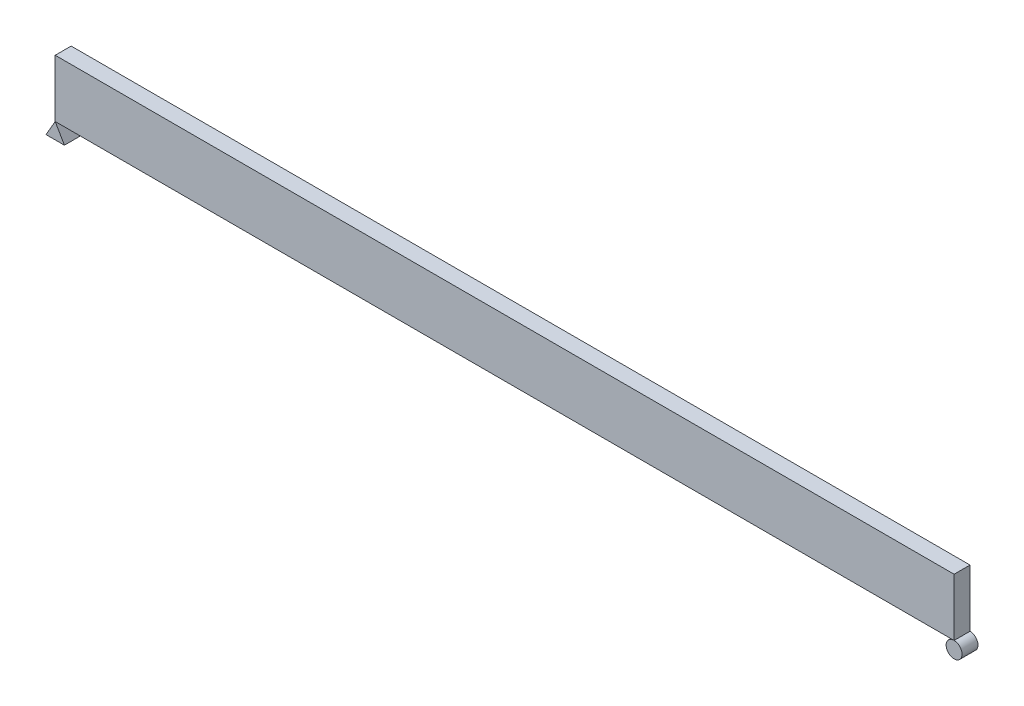
ISO-10303-21;
HEADER;
FILE_DESCRIPTION(('STEP AP214'),'2;1');
FILE_NAME('part.step','',(''),(''),'','','');
FILE_SCHEMA(('AUTOMOTIVE_DESIGN { 1 0 10303 214 1 1 1 1 }'));
ENDSEC;
DATA;
#1=APPLICATION_CONTEXT('core data for automotive mechanical design processes');
#2=APPLICATION_PROTOCOL_DEFINITION('international standard','automotive_design',2000,#1);
#3=PRODUCT_CONTEXT('',#1,'mechanical');
#4=PRODUCT('Part','Part','',(#3));
#5=PRODUCT_RELATED_PRODUCT_CATEGORY('part','',(#4));
#6=PRODUCT_DEFINITION_FORMATION('','',#4);
#7=PRODUCT_DEFINITION_CONTEXT('part definition',#1,'design');
#8=PRODUCT_DEFINITION('design','',#6,#7);
#9=PRODUCT_DEFINITION_SHAPE('','',#8);
#10=(LENGTH_UNIT() NAMED_UNIT(*) SI_UNIT(.MILLI.,.METRE.));
#11=(NAMED_UNIT(*) PLANE_ANGLE_UNIT() SI_UNIT($,.RADIAN.));
#12=(NAMED_UNIT(*) SI_UNIT($,.STERADIAN.) SOLID_ANGLE_UNIT());
#13=UNCERTAINTY_MEASURE_WITH_UNIT(LENGTH_MEASURE(1.E-05),#10,'distance_accuracy_value','');
#14=(GEOMETRIC_REPRESENTATION_CONTEXT(3) GLOBAL_UNCERTAINTY_ASSIGNED_CONTEXT((#13)) GLOBAL_UNIT_ASSIGNED_CONTEXT((#10,
#11,#12)) REPRESENTATION_CONTEXT('',''));
#15=CARTESIAN_POINT('',(0.,0.,0.));
#16=DIRECTION('',(0.,0.,1.));
#17=DIRECTION('',(1.,0.,0.));
#18=AXIS2_PLACEMENT_3D('',#15,#16,#17);
#19=CARTESIAN_POINT('',(3581.4,-292.1,127.));
#20=DIRECTION('',(0.,0.,-1.));
#21=DIRECTION('',(-1.,0.,0.));
#22=AXIS2_PLACEMENT_3D('',#19,#20,#21);
#23=CYLINDRICAL_SURFACE('',#22,63.4999999999998);
#24=CARTESIAN_POINT('',(3581.4,-292.1,0.));
#25=DIRECTION('',(0.,0.,1.));
#26=DIRECTION('',(1.,0.,0.));
#27=AXIS2_PLACEMENT_3D('',#24,#25,#26);
#28=CIRCLE('',#27,63.4999999999998);
#29=CARTESIAN_POINT('',(3644.9,-292.1,0.));
#30=VERTEX_POINT('',#29);
#31=EDGE_CURVE('E11',#30,#30,#28,.T.);
#32=ORIENTED_EDGE('',*,*,#31,.T.);
#33=EDGE_LOOP('',(#32));
#34=FACE_BOUND('',#33,.T.);
#35=CARTESIAN_POINT('',(3581.4,-292.1,127.));
#36=DIRECTION('',(0.,0.,1.));
#37=DIRECTION('',(1.,0.,0.));
#38=AXIS2_PLACEMENT_3D('',#35,#36,#37);
#39=CIRCLE('',#38,63.4999999999998);
#40=CARTESIAN_POINT('',(3644.9,-292.1,127.));
#41=VERTEX_POINT('',#40);
#42=EDGE_CURVE('E57',#41,#41,#39,.T.);
#43=ORIENTED_EDGE('',*,*,#42,.F.);
#44=EDGE_LOOP('',(#43));
#45=FACE_BOUND('',#44,.T.);
#46=ADVANCED_FACE('F53',(#34,#45),#23,.T.);
#47=CARTESIAN_POINT('',(3581.4,-292.1,127.));
#48=DIRECTION('',(0.,0.,1.));
#49=DIRECTION('',(1.,0.,0.));
#50=AXIS2_PLACEMENT_3D('',#47,#48,#49);
#51=PLANE('',#50);
#52=ORIENTED_EDGE('',*,*,#42,.T.);
#53=EDGE_LOOP('',(#52));
#54=FACE_BOUND('',#53,.T.);
#55=ADVANCED_FACE('F55',(#54),#51,.T.);
#56=CARTESIAN_POINT('',(3581.4,-292.1,0.));
#57=DIRECTION('',(0.,0.,1.));
#58=DIRECTION('',(1.,0.,0.));
#59=AXIS2_PLACEMENT_3D('',#56,#57,#58);
#60=PLANE('',#59);
#61=ORIENTED_EDGE('',*,*,#31,.F.);
#62=EDGE_LOOP('',(#61));
#63=FACE_BOUND('',#62,.T.);
#64=ADVANCED_FACE('F71',(#63),#60,.F.);
#65=CLOSED_SHELL('',(#46,#55,#64));
#66=MANIFOLD_SOLID_BREP('B2',#65);
#67=CARTESIAN_POINT('',(-3654.72348418708,-355.6,127.));
#68=DIRECTION('',(-0.866025403784437,0.500000000000003,0.));
#69=DIRECTION('',(-0.500000000000003,-0.866025403784437,0.));
#70=AXIS2_PLACEMENT_3D('',#67,#68,#69);
#71=PLANE('',#70);
#72=DIRECTION('',(0.500000000000003,0.866025403784437,0.));
#73=VECTOR('',#72,1.);
#74=CARTESIAN_POINT('',(-3654.72348418708,-355.6,0.));
#75=LINE('',#74,#73);
#76=CARTESIAN_POINT('',(-3654.72348418708,-355.6,0.));
#77=VERTEX_POINT('',#76);
#78=CARTESIAN_POINT('',(-3581.4,-228.6,0.));
#79=VERTEX_POINT('',#78);
#80=EDGE_CURVE('E51',#77,#79,#75,.T.);
#81=ORIENTED_EDGE('',*,*,#80,.F.);
#82=DIRECTION('',(0.,0.,-1.));
#83=VECTOR('',#82,1.);
#84=CARTESIAN_POINT('',(-3654.72348418708,-355.6,127.));
#85=LINE('',#84,#83);
#86=CARTESIAN_POINT('',(-3654.72348418708,-355.6,127.));
#87=VERTEX_POINT('',#86);
#88=EDGE_CURVE('E143',#87,#77,#85,.T.);
#89=ORIENTED_EDGE('',*,*,#88,.F.);
#90=DIRECTION('',(0.500000000000003,0.866025403784437,0.));
#91=VECTOR('',#90,1.);
#92=CARTESIAN_POINT('',(-3654.72348418708,-355.6,127.));
#93=LINE('',#92,#91);
#94=CARTESIAN_POINT('',(-3581.4,-228.6,127.));
#95=VERTEX_POINT('',#94);
#96=EDGE_CURVE('E145',#87,#95,#93,.T.);
#97=ORIENTED_EDGE('',*,*,#96,.T.);
#98=DIRECTION('',(0.,0.,-1.));
#99=VECTOR('',#98,1.);
#100=CARTESIAN_POINT('',(-3581.4,-228.6,127.));
#101=LINE('',#100,#99);
#102=EDGE_CURVE('E109',#95,#79,#101,.T.);
#103=ORIENTED_EDGE('',*,*,#102,.T.);
#104=EDGE_LOOP('',(#81,#89,#97,#103));
#105=FACE_BOUND('',#104,.T.);
#106=ADVANCED_FACE('F105',(#105),#71,.T.);
#107=CARTESIAN_POINT('',(-3508.07651581292,-355.6,127.));
#108=DIRECTION('',(0.,-1.,0.));
#109=DIRECTION('',(1.,0.,0.));
#110=AXIS2_PLACEMENT_3D('',#107,#108,#109);
#111=PLANE('',#110);
#112=DIRECTION('',(-1.,0.,0.));
#113=VECTOR('',#112,1.);
#114=CARTESIAN_POINT('',(-3508.07651581292,-355.6,0.));
#115=LINE('',#114,#113);
#116=CARTESIAN_POINT('',(-3508.07651581292,-355.6,0.));
#117=VERTEX_POINT('',#116);
#118=EDGE_CURVE('E148',#117,#77,#115,.T.);
#119=ORIENTED_EDGE('',*,*,#118,.F.);
#120=DIRECTION('',(0.,0.,-1.));
#121=VECTOR('',#120,1.);
#122=CARTESIAN_POINT('',(-3508.07651581292,-355.6,127.));
#123=LINE('',#122,#121);
#124=CARTESIAN_POINT('',(-3508.07651581292,-355.6,127.));
#125=VERTEX_POINT('',#124);
#126=EDGE_CURVE('E124',#125,#117,#123,.T.);
#127=ORIENTED_EDGE('',*,*,#126,.F.);
#128=DIRECTION('',(-1.,0.,0.));
#129=VECTOR('',#128,1.);
#130=CARTESIAN_POINT('',(-3508.07651581292,-355.6,127.));
#131=LINE('',#130,#129);
#132=EDGE_CURVE('E149',#125,#87,#131,.T.);
#133=ORIENTED_EDGE('',*,*,#132,.T.);
#134=ORIENTED_EDGE('',*,*,#88,.T.);
#135=EDGE_LOOP('',(#119,#127,#133,#134));
#136=FACE_BOUND('',#135,.T.);
#137=ADVANCED_FACE('F159',(#136),#111,.T.);
#138=CARTESIAN_POINT('',(-3581.4,-228.6,127.));
#139=DIRECTION('',(0.866025403784437,0.500000000000003,0.));
#140=DIRECTION('',(-0.500000000000003,0.866025403784437,0.));
#141=AXIS2_PLACEMENT_3D('',#138,#139,#140);
#142=PLANE('',#141);
#143=DIRECTION('',(0.500000000000003,-0.866025403784437,0.));
#144=VECTOR('',#143,1.);
#145=CARTESIAN_POINT('',(-3581.4,-228.6,0.));
#146=LINE('',#145,#144);
#147=EDGE_CURVE('E115',#79,#117,#146,.T.);
#148=ORIENTED_EDGE('',*,*,#147,.F.);
#149=ORIENTED_EDGE('',*,*,#102,.F.);
#150=DIRECTION('',(0.500000000000003,-0.866025403784437,0.));
#151=VECTOR('',#150,1.);
#152=CARTESIAN_POINT('',(-3581.4,-228.6,127.));
#153=LINE('',#152,#151);
#154=EDGE_CURVE('E141',#95,#125,#153,.T.);
#155=ORIENTED_EDGE('',*,*,#154,.T.);
#156=ORIENTED_EDGE('',*,*,#126,.T.);
#157=EDGE_LOOP('',(#148,#149,#155,#156));
#158=FACE_BOUND('',#157,.T.);
#159=ADVANCED_FACE('F139',(#158),#142,.T.);
#160=CARTESIAN_POINT('',(0.,0.,127.));
#161=DIRECTION('',(0.,0.,-1.));
#162=DIRECTION('',(-1.,0.,0.));
#163=AXIS2_PLACEMENT_3D('',#160,#161,#162);
#164=PLANE('',#163);
#165=ORIENTED_EDGE('',*,*,#96,.F.);
#166=ORIENTED_EDGE('',*,*,#132,.F.);
#167=ORIENTED_EDGE('',*,*,#154,.F.);
#168=EDGE_LOOP('',(#165,#166,#167));
#169=FACE_BOUND('',#168,.T.);
#170=ADVANCED_FACE('F107',(#169),#164,.F.);
#171=CARTESIAN_POINT('',(0.,0.,0.));
#172=DIRECTION('',(0.,0.,-1.));
#173=DIRECTION('',(-1.,0.,0.));
#174=AXIS2_PLACEMENT_3D('',#171,#172,#173);
#175=PLANE('',#174);
#176=ORIENTED_EDGE('',*,*,#80,.T.);
#177=ORIENTED_EDGE('',*,*,#147,.T.);
#178=ORIENTED_EDGE('',*,*,#118,.T.);
#179=EDGE_LOOP('',(#176,#177,#178));
#180=FACE_BOUND('',#179,.T.);
#181=ADVANCED_FACE('F161',(#180),#175,.T.);
#182=CLOSED_SHELL('',(#106,#137,#159,#170,#181));
#183=MANIFOLD_SOLID_BREP('B6',#182);
#184=CARTESIAN_POINT('',(3581.4,0.,127.));
#185=DIRECTION('',(1.,0.,0.));
#186=DIRECTION('',(0.,0.,-1.));
#187=AXIS2_PLACEMENT_3D('',#184,#185,#186);
#188=PLANE('',#187);
#189=DIRECTION('',(0.,-1.,0.));
#190=VECTOR('',#189,1.);
#191=CARTESIAN_POINT('',(3581.4,0.,0.));
#192=LINE('',#191,#190);
#193=CARTESIAN_POINT('',(3581.4,228.6,0.));
#194=VERTEX_POINT('',#193);
#195=CARTESIAN_POINT('',(3581.4,-228.6,0.));
#196=VERTEX_POINT('',#195);
#197=EDGE_CURVE('E224',#194,#196,#192,.T.);
#198=ORIENTED_EDGE('',*,*,#197,.F.);
#199=DIRECTION('',(0.,0.,-1.));
#200=VECTOR('',#199,1.);
#201=CARTESIAN_POINT('',(3581.4,228.6,127.));
#202=LINE('',#201,#200);
#203=CARTESIAN_POINT('',(3581.4,228.6,127.));
#204=VERTEX_POINT('',#203);
#205=EDGE_CURVE('E206',#204,#194,#202,.T.);
#206=ORIENTED_EDGE('',*,*,#205,.F.);
#207=DIRECTION('',(0.,-1.,0.));
#208=VECTOR('',#207,1.);
#209=CARTESIAN_POINT('',(3581.4,0.,127.));
#210=LINE('',#209,#208);
#211=CARTESIAN_POINT('',(3581.4,-228.6,127.));
#212=VERTEX_POINT('',#211);
#213=EDGE_CURVE('E244',#204,#212,#210,.T.);
#214=ORIENTED_EDGE('',*,*,#213,.T.);
#215=DIRECTION('',(0.,0.,-1.));
#216=VECTOR('',#215,1.);
#217=CARTESIAN_POINT('',(3581.4,-228.6,127.));
#218=LINE('',#217,#216);
#219=EDGE_CURVE('E103',#212,#196,#218,.T.);
#220=ORIENTED_EDGE('',*,*,#219,.T.);
#221=EDGE_LOOP('',(#198,#206,#214,#220));
#222=FACE_BOUND('',#221,.T.);
#223=ADVANCED_FACE('F203',(#222),#188,.T.);
#224=CARTESIAN_POINT('',(0.,228.6,127.));
#225=DIRECTION('',(0.,1.,0.));
#226=DIRECTION('',(0.,0.,1.));
#227=AXIS2_PLACEMENT_3D('',#224,#225,#226);
#228=PLANE('',#227);
#229=DIRECTION('',(1.,0.,0.));
#230=VECTOR('',#229,1.);
#231=CARTESIAN_POINT('',(0.,228.6,0.));
#232=LINE('',#231,#230);
#233=CARTESIAN_POINT('',(-3581.4,228.6,0.));
#234=VERTEX_POINT('',#233);
#235=EDGE_CURVE('E266',#234,#194,#232,.T.);
#236=ORIENTED_EDGE('',*,*,#235,.F.);
#237=DIRECTION('',(0.,0.,-1.));
#238=VECTOR('',#237,1.);
#239=CARTESIAN_POINT('',(-3581.4,228.6,127.));
#240=LINE('',#239,#238);
#241=CARTESIAN_POINT('',(-3581.4,228.6,127.));
#242=VERTEX_POINT('',#241);
#243=EDGE_CURVE('E249',#242,#234,#240,.T.);
#244=ORIENTED_EDGE('',*,*,#243,.F.);
#245=DIRECTION('',(1.,0.,0.));
#246=VECTOR('',#245,1.);
#247=CARTESIAN_POINT('',(0.,228.6,127.));
#248=LINE('',#247,#246);
#249=EDGE_CURVE('E254',#242,#204,#248,.T.);
#250=ORIENTED_EDGE('',*,*,#249,.T.);
#251=ORIENTED_EDGE('',*,*,#205,.T.);
#252=EDGE_LOOP('',(#236,#244,#250,#251));
#253=FACE_BOUND('',#252,.T.);
#254=ADVANCED_FACE('F258',(#253),#228,.T.);
#255=CARTESIAN_POINT('',(-3581.4,0.,127.));
#256=DIRECTION('',(1.,0.,0.));
#257=DIRECTION('',(0.,0.,-1.));
#258=AXIS2_PLACEMENT_3D('',#255,#256,#257);
#259=PLANE('',#258);
#260=DIRECTION('',(0.,-1.,0.));
#261=VECTOR('',#260,1.);
#262=CARTESIAN_POINT('',(-3581.4,0.,0.));
#263=LINE('',#262,#261);
#264=CARTESIAN_POINT('',(-3581.4,-228.6,0.));
#265=VERTEX_POINT('',#264);
#266=EDGE_CURVE('E268',#234,#265,#263,.T.);
#267=ORIENTED_EDGE('',*,*,#266,.T.);
#268=DIRECTION('',(0.,0.,-1.));
#269=VECTOR('',#268,1.);
#270=CARTESIAN_POINT('',(-3581.4,-228.6,127.));
#271=LINE('',#270,#269);
#272=CARTESIAN_POINT('',(-3581.4,-228.6,127.));
#273=VERTEX_POINT('',#272);
#274=EDGE_CURVE('E211',#273,#265,#271,.T.);
#275=ORIENTED_EDGE('',*,*,#274,.F.);
#276=DIRECTION('',(0.,-1.,0.));
#277=VECTOR('',#276,1.);
#278=CARTESIAN_POINT('',(-3581.4,0.,127.));
#279=LINE('',#278,#277);
#280=EDGE_CURVE('E260',#242,#273,#279,.T.);
#281=ORIENTED_EDGE('',*,*,#280,.F.);
#282=ORIENTED_EDGE('',*,*,#243,.T.);
#283=EDGE_LOOP('',(#267,#275,#281,#282));
#284=FACE_BOUND('',#283,.T.);
#285=ADVANCED_FACE('F274',(#284),#259,.F.);
#286=CARTESIAN_POINT('',(0.,-228.6,127.));
#287=DIRECTION('',(0.,1.,0.));
#288=DIRECTION('',(0.,0.,1.));
#289=AXIS2_PLACEMENT_3D('',#286,#287,#288);
#290=PLANE('',#289);
#291=DIRECTION('',(1.,0.,0.));
#292=VECTOR('',#291,1.);
#293=CARTESIAN_POINT('',(0.,-228.6,0.));
#294=LINE('',#293,#292);
#295=EDGE_CURVE('E219',#265,#196,#294,.T.);
#296=ORIENTED_EDGE('',*,*,#295,.T.);
#297=ORIENTED_EDGE('',*,*,#219,.F.);
#298=DIRECTION('',(1.,0.,0.));
#299=VECTOR('',#298,1.);
#300=CARTESIAN_POINT('',(0.,-228.6,127.));
#301=LINE('',#300,#299);
#302=EDGE_CURVE('E255',#273,#212,#301,.T.);
#303=ORIENTED_EDGE('',*,*,#302,.F.);
#304=ORIENTED_EDGE('',*,*,#274,.T.);
#305=EDGE_LOOP('',(#296,#297,#303,#304));
#306=FACE_BOUND('',#305,.T.);
#307=ADVANCED_FACE('F283',(#306),#290,.F.);
#308=CARTESIAN_POINT('',(0.,0.,127.));
#309=DIRECTION('',(0.,0.,1.));
#310=DIRECTION('',(1.,0.,0.));
#311=AXIS2_PLACEMENT_3D('',#308,#309,#310);
#312=PLANE('',#311);
#313=ORIENTED_EDGE('',*,*,#213,.F.);
#314=ORIENTED_EDGE('',*,*,#249,.F.);
#315=ORIENTED_EDGE('',*,*,#280,.T.);
#316=ORIENTED_EDGE('',*,*,#302,.T.);
#317=EDGE_LOOP('',(#313,#314,#315,#316));
#318=FACE_BOUND('',#317,.T.);
#319=ADVANCED_FACE('F252',(#318),#312,.T.);
#320=CARTESIAN_POINT('',(0.,0.,0.));
#321=DIRECTION('',(0.,0.,1.));
#322=DIRECTION('',(1.,0.,0.));
#323=AXIS2_PLACEMENT_3D('',#320,#321,#322);
#324=PLANE('',#323);
#325=ORIENTED_EDGE('',*,*,#197,.T.);
#326=ORIENTED_EDGE('',*,*,#295,.F.);
#327=ORIENTED_EDGE('',*,*,#266,.F.);
#328=ORIENTED_EDGE('',*,*,#235,.T.);
#329=EDGE_LOOP('',(#325,#326,#327,#328));
#330=FACE_BOUND('',#329,.T.);
#331=ADVANCED_FACE('F276',(#330),#324,.F.);
#332=CLOSED_SHELL('',(#223,#254,#285,#307,#319,#331));
#333=MANIFOLD_SOLID_BREP('B45',#332);
#334=ADVANCED_BREP_SHAPE_REPRESENTATION('',(#18,#66,#183,#333),#14);
#335=SHAPE_DEFINITION_REPRESENTATION(#9,#334);
ENDSEC;
END-ISO-10303-21;
